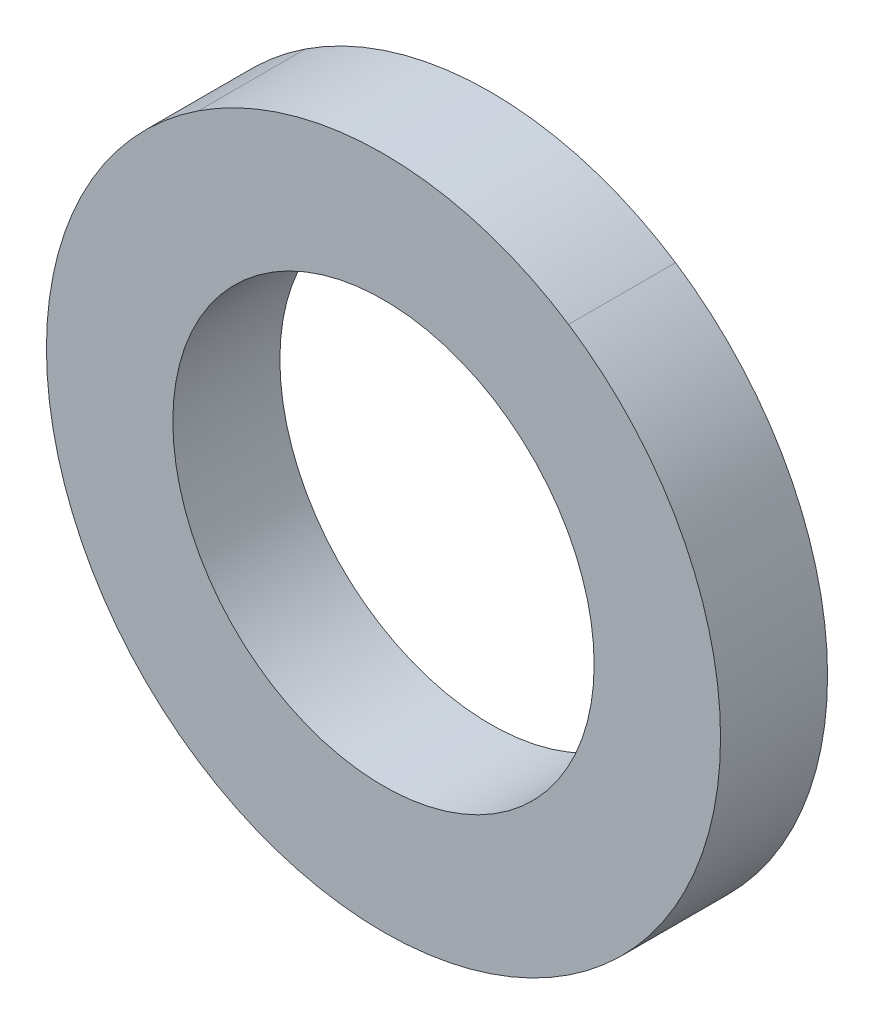
ISO-10303-21;
HEADER;
FILE_DESCRIPTION(('STEP AP214'),'2;1');
FILE_NAME('part.step','',(''),(''),'','','');
FILE_SCHEMA(('AUTOMOTIVE_DESIGN { 1 0 10303 214 1 1 1 1 }'));
ENDSEC;
DATA;
#1=APPLICATION_CONTEXT('core data for automotive mechanical design processes');
#2=APPLICATION_PROTOCOL_DEFINITION('international standard','automotive_design',2000,#1);
#3=PRODUCT_CONTEXT('',#1,'mechanical');
#4=PRODUCT('Part','Part','',(#3));
#5=PRODUCT_RELATED_PRODUCT_CATEGORY('part','',(#4));
#6=PRODUCT_DEFINITION_FORMATION('','',#4);
#7=PRODUCT_DEFINITION_CONTEXT('part definition',#1,'design');
#8=PRODUCT_DEFINITION('design','',#6,#7);
#9=PRODUCT_DEFINITION_SHAPE('','',#8);
#10=(LENGTH_UNIT() NAMED_UNIT(*) SI_UNIT(.MILLI.,.METRE.));
#11=(NAMED_UNIT(*) PLANE_ANGLE_UNIT() SI_UNIT($,.RADIAN.));
#12=(NAMED_UNIT(*) SI_UNIT($,.STERADIAN.) SOLID_ANGLE_UNIT());
#13=UNCERTAINTY_MEASURE_WITH_UNIT(LENGTH_MEASURE(1.E-05),#10,'distance_accuracy_value','');
#14=(GEOMETRIC_REPRESENTATION_CONTEXT(3) GLOBAL_UNCERTAINTY_ASSIGNED_CONTEXT((#13)) GLOBAL_UNIT_ASSIGNED_CONTEXT((#10,
#11,#12)) REPRESENTATION_CONTEXT('',''));
#15=CARTESIAN_POINT('',(0.,0.,0.));
#16=DIRECTION('',(0.,0.,1.));
#17=DIRECTION('',(1.,0.,0.));
#18=AXIS2_PLACEMENT_3D('',#15,#16,#17);
#19=CARTESIAN_POINT('',(0.,0.,12.7));
#20=DIRECTION('',(0.,0.,-1.));
#21=DIRECTION('',(-1.,0.,0.));
#22=AXIS2_PLACEMENT_3D('',#19,#20,#21);
#23=CYLINDRICAL_SURFACE('',#22,40.);
#24=DIRECTION('',(0.,0.,-1.));
#25=VECTOR('',#24,1.);
#26=CARTESIAN_POINT('',(21.9628372360461,33.431030204631,12.7));
#27=LINE('',#26,#25);
#28=CARTESIAN_POINT('',(21.9628372360461,33.431030204631,12.7));
#29=VERTEX_POINT('',#28);
#30=CARTESIAN_POINT('',(21.9628372360461,33.431030204631,0.));
#31=VERTEX_POINT('',#30);
#32=EDGE_CURVE('E13',#29,#31,#27,.T.);
#33=ORIENTED_EDGE('',*,*,#32,.F.);
#34=CARTESIAN_POINT('',(0.,0.,12.7));
#35=DIRECTION('',(0.,0.,1.));
#36=DIRECTION('',(1.,0.,0.));
#37=AXIS2_PLACEMENT_3D('',#34,#35,#36);
#38=CIRCLE('',#37,40.);
#39=CARTESIAN_POINT('',(21.9628372360461,-33.431030204631,12.7));
#40=VERTEX_POINT('',#39);
#41=EDGE_CURVE('E89',#40,#29,#38,.T.);
#42=ORIENTED_EDGE('',*,*,#41,.F.);
#43=DIRECTION('',(0.,0.,-1.));
#44=VECTOR('',#43,1.);
#45=CARTESIAN_POINT('',(21.9628372360461,-33.431030204631,12.7));
#46=LINE('',#45,#44);
#47=CARTESIAN_POINT('',(21.9628372360461,-33.431030204631,0.));
#48=VERTEX_POINT('',#47);
#49=EDGE_CURVE('E58',#48,#40,#46,.F.);
#50=ORIENTED_EDGE('',*,*,#49,.F.);
#51=CARTESIAN_POINT('',(0.,0.,0.));
#52=DIRECTION('',(0.,0.,1.));
#53=DIRECTION('',(1.,0.,0.));
#54=AXIS2_PLACEMENT_3D('',#51,#52,#53);
#55=CIRCLE('',#54,40.);
#56=EDGE_CURVE('E91',#48,#31,#55,.T.);
#57=ORIENTED_EDGE('',*,*,#56,.T.);
#58=EDGE_LOOP('',(#33,#42,#50,#57));
#59=FACE_BOUND('',#58,.T.);
#60=ADVANCED_FACE('F49',(#59),#23,.T.);
#61=CARTESIAN_POINT('',(-21.9628372360461,33.431030204631,12.7));
#62=VERTEX_POINT('',#61);
#63=EDGE_CURVE('E100',#29,#62,#38,.T.);
#64=ORIENTED_EDGE('',*,*,#63,.F.);
#65=ORIENTED_EDGE('',*,*,#32,.T.);
#66=CARTESIAN_POINT('',(-21.9628372360461,33.431030204631,0.));
#67=VERTEX_POINT('',#66);
#68=EDGE_CURVE('E102',#31,#67,#55,.T.);
#69=ORIENTED_EDGE('',*,*,#68,.T.);
#70=DIRECTION('',(0.,0.,-1.));
#71=VECTOR('',#70,1.);
#72=CARTESIAN_POINT('',(-21.9628372360461,33.431030204631,12.7));
#73=LINE('',#72,#71);
#74=EDGE_CURVE('E105',#67,#62,#73,.F.);
#75=ORIENTED_EDGE('',*,*,#74,.T.);
#76=EDGE_LOOP('',(#64,#65,#69,#75));
#77=FACE_BOUND('',#76,.T.);
#78=ADVANCED_FACE('F104',(#77),#23,.T.);
#79=DIRECTION('',(0.,0.,-1.));
#80=VECTOR('',#79,1.);
#81=CARTESIAN_POINT('',(-21.9628372360461,-33.431030204631,12.7));
#82=LINE('',#81,#80);
#83=CARTESIAN_POINT('',(-21.9628372360461,-33.431030204631,12.7));
#84=VERTEX_POINT('',#83);
#85=CARTESIAN_POINT('',(-21.9628372360461,-33.431030204631,0.));
#86=VERTEX_POINT('',#85);
#87=EDGE_CURVE('E72',#84,#86,#82,.T.);
#88=ORIENTED_EDGE('',*,*,#87,.F.);
#89=EDGE_CURVE('E107',#62,#84,#38,.T.);
#90=ORIENTED_EDGE('',*,*,#89,.F.);
#91=ORIENTED_EDGE('',*,*,#74,.F.);
#92=EDGE_CURVE('E114',#67,#86,#55,.T.);
#93=ORIENTED_EDGE('',*,*,#92,.T.);
#94=EDGE_LOOP('',(#88,#90,#91,#93));
#95=FACE_BOUND('',#94,.T.);
#96=ADVANCED_FACE('F127',(#95),#23,.T.);
#97=EDGE_CURVE('E122',#86,#48,#55,.T.);
#98=ORIENTED_EDGE('',*,*,#97,.T.);
#99=ORIENTED_EDGE('',*,*,#49,.T.);
#100=EDGE_CURVE('E101',#84,#40,#38,.T.);
#101=ORIENTED_EDGE('',*,*,#100,.F.);
#102=ORIENTED_EDGE('',*,*,#87,.T.);
#103=EDGE_LOOP('',(#98,#99,#101,#102));
#104=FACE_BOUND('',#103,.T.);
#105=ADVANCED_FACE('F51',(#104),#23,.T.);
#106=CARTESIAN_POINT('',(0.,0.,12.7));
#107=DIRECTION('',(0.,0.,1.));
#108=DIRECTION('',(1.,0.,0.));
#109=AXIS2_PLACEMENT_3D('',#106,#107,#108);
#110=PLANE('',#109);
#111=CARTESIAN_POINT('',(0.,0.,12.7));
#112=DIRECTION('',(0.,0.,1.));
#113=DIRECTION('',(1.,0.,0.));
#114=AXIS2_PLACEMENT_3D('',#111,#112,#113);
#115=CIRCLE('',#114,25.);
#116=CARTESIAN_POINT('',(25.,0.,12.7));
#117=VERTEX_POINT('',#116);
#118=EDGE_CURVE('E112',#117,#117,#115,.T.);
#119=ORIENTED_EDGE('',*,*,#118,.F.);
#120=EDGE_LOOP('',(#119));
#121=FACE_BOUND('',#120,.T.);
#122=ORIENTED_EDGE('',*,*,#63,.T.);
#123=ORIENTED_EDGE('',*,*,#89,.T.);
#124=ORIENTED_EDGE('',*,*,#100,.T.);
#125=ORIENTED_EDGE('',*,*,#41,.T.);
#126=EDGE_LOOP('',(#122,#123,#124,#125));
#127=FACE_BOUND('',#126,.T.);
#128=ADVANCED_FACE('F98',(#121,#127),#110,.T.);
#129=CARTESIAN_POINT('',(0.,0.,0.));
#130=DIRECTION('',(0.,0.,1.));
#131=DIRECTION('',(1.,0.,0.));
#132=AXIS2_PLACEMENT_3D('',#129,#130,#131);
#133=PLANE('',#132);
#134=CARTESIAN_POINT('',(0.,0.,0.));
#135=DIRECTION('',(0.,0.,1.));
#136=DIRECTION('',(1.,0.,0.));
#137=AXIS2_PLACEMENT_3D('',#134,#135,#136);
#138=CIRCLE('',#137,25.);
#139=CARTESIAN_POINT('',(25.,0.,0.));
#140=VERTEX_POINT('',#139);
#141=EDGE_CURVE('E115',#140,#140,#138,.T.);
#142=ORIENTED_EDGE('',*,*,#141,.T.);
#143=EDGE_LOOP('',(#142));
#144=FACE_BOUND('',#143,.T.);
#145=ORIENTED_EDGE('',*,*,#68,.F.);
#146=ORIENTED_EDGE('',*,*,#56,.F.);
#147=ORIENTED_EDGE('',*,*,#97,.F.);
#148=ORIENTED_EDGE('',*,*,#92,.F.);
#149=EDGE_LOOP('',(#145,#146,#147,#148));
#150=FACE_BOUND('',#149,.T.);
#151=ADVANCED_FACE('F128',(#144,#150),#133,.F.);
#152=CARTESIAN_POINT('',(0.,0.,-88.9));
#153=DIRECTION('',(0.,0.,1.));
#154=DIRECTION('',(1.,0.,0.));
#155=AXIS2_PLACEMENT_3D('',#152,#153,#154);
#156=CYLINDRICAL_SURFACE('',#155,25.);
#157=ORIENTED_EDGE('',*,*,#118,.T.);
#158=EDGE_LOOP('',(#157));
#159=FACE_BOUND('',#158,.T.);
#160=ORIENTED_EDGE('',*,*,#141,.F.);
#161=EDGE_LOOP('',(#160));
#162=FACE_BOUND('',#161,.T.);
#163=ADVANCED_FACE('F130',(#159,#162),#156,.F.);
#164=CLOSED_SHELL('',(#60,#78,#96,#105,#128,#151,#163));
#165=MANIFOLD_SOLID_BREP('B2',#164);
#166=ADVANCED_BREP_SHAPE_REPRESENTATION('',(#18,#165),#14);
#167=SHAPE_DEFINITION_REPRESENTATION(#9,#166);
ENDSEC;
END-ISO-10303-21;
